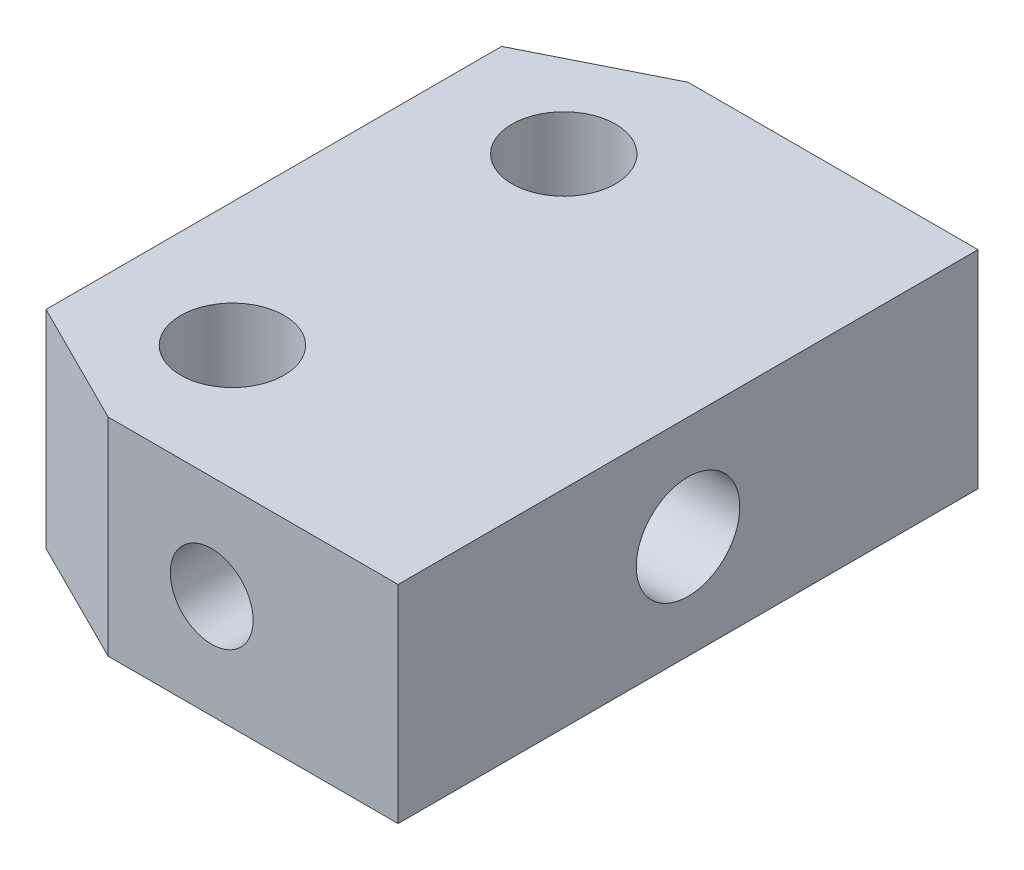
ISO-10303-21;
HEADER;
FILE_DESCRIPTION(('STEP AP214'),'2;1');
FILE_NAME('part.step','',(''),(''),'','','');
FILE_SCHEMA(('AUTOMOTIVE_DESIGN { 1 0 10303 214 1 1 1 1 }'));
ENDSEC;
DATA;
#1=APPLICATION_CONTEXT('core data for automotive mechanical design processes');
#2=APPLICATION_PROTOCOL_DEFINITION('international standard','automotive_design',2000,#1);
#3=PRODUCT_CONTEXT('',#1,'mechanical');
#4=PRODUCT('Part','Part','',(#3));
#5=PRODUCT_RELATED_PRODUCT_CATEGORY('part','',(#4));
#6=PRODUCT_DEFINITION_FORMATION('','',#4);
#7=PRODUCT_DEFINITION_CONTEXT('part definition',#1,'design');
#8=PRODUCT_DEFINITION('design','',#6,#7);
#9=PRODUCT_DEFINITION_SHAPE('','',#8);
#10=(LENGTH_UNIT() NAMED_UNIT(*) SI_UNIT(.MILLI.,.METRE.));
#11=(NAMED_UNIT(*) PLANE_ANGLE_UNIT() SI_UNIT($,.RADIAN.));
#12=(NAMED_UNIT(*) SI_UNIT($,.STERADIAN.) SOLID_ANGLE_UNIT());
#13=UNCERTAINTY_MEASURE_WITH_UNIT(LENGTH_MEASURE(1.E-05),#10,'distance_accuracy_value','');
#14=(GEOMETRIC_REPRESENTATION_CONTEXT(3) GLOBAL_UNCERTAINTY_ASSIGNED_CONTEXT((#13)) GLOBAL_UNIT_ASSIGNED_CONTEXT((#10,
#11,#12)) REPRESENTATION_CONTEXT('',''));
#15=CARTESIAN_POINT('',(0.,0.,0.));
#16=DIRECTION('',(0.,0.,1.));
#17=DIRECTION('',(1.,0.,0.));
#18=AXIS2_PLACEMENT_3D('',#15,#16,#17);
#19=CARTESIAN_POINT('',(49.9999999113847,-75.0000011423657,-47.5000000259094));
#20=DIRECTION('',(-1.,0.,0.));
#21=DIRECTION('',(0.,0.,1.));
#22=AXIS2_PLACEMENT_3D('',#19,#20,#21);
#23=PLANE('',#22);
#24=CARTESIAN_POINT('',(49.9999999113847,-70.0000001948221,-33.5000000259094));
#25=DIRECTION('',(-1.,0.,0.));
#26=DIRECTION('',(0.,0.,1.));
#27=AXIS2_PLACEMENT_3D('',#24,#25,#26);
#28=CIRCLE('',#27,2.49999999999999);
#29=CARTESIAN_POINT('',(49.9999999113847,-70.0000001948221,-31.0000000259094));
#30=VERTEX_POINT('',#29);
#31=EDGE_CURVE('E198',#30,#30,#28,.T.);
#32=ORIENTED_EDGE('',*,*,#31,.F.);
#33=EDGE_LOOP('',(#32));
#34=FACE_BOUND('',#33,.T.);
#35=DIRECTION('',(0.,0.,1.));
#36=VECTOR('',#35,1.);
#37=CARTESIAN_POINT('',(49.9999999113847,-75.0000011423657,-47.5000000259094));
#38=LINE('',#37,#36);
#39=CARTESIAN_POINT('',(49.9999999113847,-75.0000011423657,-44.499999955065));
#40=VERTEX_POINT('',#39);
#41=CARTESIAN_POINT('',(49.9999999113847,-75.0000011423657,-22.5000000967538));
#42=VERTEX_POINT('',#41);
#43=EDGE_CURVE('E94',#40,#42,#38,.T.);
#44=ORIENTED_EDGE('',*,*,#43,.T.);
#45=DIRECTION('',(0.,1.,0.));
#46=VECTOR('',#45,1.);
#47=CARTESIAN_POINT('',(49.9999999113847,-75.0000011423657,-22.5000000967538));
#48=LINE('',#47,#46);
#49=CARTESIAN_POINT('',(49.9999999113847,-65.0000010803768,-22.5000000967538));
#50=VERTEX_POINT('',#49);
#51=EDGE_CURVE('E209',#42,#50,#48,.T.);
#52=ORIENTED_EDGE('',*,*,#51,.T.);
#53=DIRECTION('',(0.,0.,1.));
#54=VECTOR('',#53,1.);
#55=CARTESIAN_POINT('',(49.9999999113847,-65.0000010803768,-47.5000000259094));
#56=LINE('',#55,#54);
#57=CARTESIAN_POINT('',(49.9999999113847,-65.0000010803768,-44.499999955065));
#58=VERTEX_POINT('',#57);
#59=EDGE_CURVE('E109',#58,#50,#56,.T.);
#60=ORIENTED_EDGE('',*,*,#59,.F.);
#61=DIRECTION('',(0.,-1.,0.));
#62=VECTOR('',#61,1.);
#63=CARTESIAN_POINT('',(49.9999999113847,-75.0000011423657,-44.499999955065));
#64=LINE('',#63,#62);
#65=EDGE_CURVE('E119',#58,#40,#64,.T.);
#66=ORIENTED_EDGE('',*,*,#65,.T.);
#67=EDGE_LOOP('',(#44,#52,#60,#66));
#68=FACE_BOUND('',#67,.T.);
#69=ADVANCED_FACE('F32',(#34,#68),#23,.T.);
#70=CARTESIAN_POINT('',(69.9999999556625,-75.0000011423657,-47.5000000259094));
#71=DIRECTION('',(0.,0.,-1.));
#72=DIRECTION('',(-1.,0.,0.));
#73=AXIS2_PLACEMENT_3D('',#70,#71,#72);
#74=PLANE('',#73);
#75=CARTESIAN_POINT('',(60.9999999999402,-70.,-47.5000000259094));
#76=DIRECTION('',(0.,0.,-1.));
#77=DIRECTION('',(-1.,0.,0.));
#78=AXIS2_PLACEMENT_3D('',#75,#76,#77);
#79=CIRCLE('',#78,1.99999999999999);
#80=CARTESIAN_POINT('',(58.9999999999402,-70.,-47.5000000259094));
#81=VERTEX_POINT('',#80);
#82=EDGE_CURVE('E129',#81,#81,#79,.T.);
#83=ORIENTED_EDGE('',*,*,#82,.F.);
#84=EDGE_LOOP('',(#83));
#85=FACE_BOUND('',#84,.T.);
#86=DIRECTION('',(-1.,0.,0.));
#87=VECTOR('',#86,1.);
#88=CARTESIAN_POINT('',(69.9999999556625,-75.0000011423657,-47.5000000259094));
#89=LINE('',#88,#87);
#90=CARTESIAN_POINT('',(69.9999999556625,-75.0000011423657,-47.5000000259094));
#91=VERTEX_POINT('',#90);
#92=CARTESIAN_POINT('',(56.0000000530734,-75.0000011423657,-47.5000000259094));
#93=VERTEX_POINT('',#92);
#94=EDGE_CURVE('E102',#91,#93,#89,.T.);
#95=ORIENTED_EDGE('',*,*,#94,.T.);
#96=DIRECTION('',(0.,1.,0.));
#97=VECTOR('',#96,1.);
#98=CARTESIAN_POINT('',(56.0000000530734,-75.0000011423657,-47.5000000259094));
#99=LINE('',#98,#97);
#100=CARTESIAN_POINT('',(56.0000000530734,-65.0000010803768,-47.5000000259094));
#101=VERTEX_POINT('',#100);
#102=EDGE_CURVE('E11',#93,#101,#99,.T.);
#103=ORIENTED_EDGE('',*,*,#102,.T.);
#104=DIRECTION('',(-1.,0.,0.));
#105=VECTOR('',#104,1.);
#106=CARTESIAN_POINT('',(69.9999999556625,-65.0000010803768,-47.5000000259094));
#107=LINE('',#106,#105);
#108=CARTESIAN_POINT('',(69.9999999556625,-65.0000010803768,-47.5000000259094));
#109=VERTEX_POINT('',#108);
#110=EDGE_CURVE('E116',#109,#101,#107,.T.);
#111=ORIENTED_EDGE('',*,*,#110,.F.);
#112=DIRECTION('',(0.,1.,0.));
#113=VECTOR('',#112,1.);
#114=CARTESIAN_POINT('',(69.9999999556625,-75.0000011423657,-47.5000000259094));
#115=LINE('',#114,#113);
#116=EDGE_CURVE('E101',#91,#109,#115,.T.);
#117=ORIENTED_EDGE('',*,*,#116,.F.);
#118=EDGE_LOOP('',(#95,#103,#111,#117));
#119=FACE_BOUND('',#118,.T.);
#120=ADVANCED_FACE('F152',(#85,#119),#74,.T.);
#121=CARTESIAN_POINT('',(69.9999999556625,-75.0000011423657,-19.5000000259094));
#122=DIRECTION('',(1.,0.,0.));
#123=DIRECTION('',(0.,0.,-1.));
#124=AXIS2_PLACEMENT_3D('',#121,#122,#123);
#125=PLANE('',#124);
#126=CARTESIAN_POINT('',(69.9999999556625,-70.0000001948221,-33.5000000259094));
#127=DIRECTION('',(-1.,0.,0.));
#128=DIRECTION('',(0.,0.,1.));
#129=AXIS2_PLACEMENT_3D('',#126,#127,#128);
#130=CIRCLE('',#129,2.49999999999999);
#131=CARTESIAN_POINT('',(69.9999999556625,-70.0000001948221,-31.0000000259094));
#132=VERTEX_POINT('',#131);
#133=EDGE_CURVE('E193',#132,#132,#130,.T.);
#134=ORIENTED_EDGE('',*,*,#133,.T.);
#135=EDGE_LOOP('',(#134));
#136=FACE_BOUND('',#135,.T.);
#137=DIRECTION('',(0.,0.,-1.));
#138=VECTOR('',#137,1.);
#139=CARTESIAN_POINT('',(69.9999999556625,-65.0000010803768,-19.5000000259094));
#140=LINE('',#139,#138);
#141=CARTESIAN_POINT('',(69.9999999556625,-65.0000010803768,-19.5000000259094));
#142=VERTEX_POINT('',#141);
#143=EDGE_CURVE('E100',#142,#109,#140,.T.);
#144=ORIENTED_EDGE('',*,*,#143,.F.);
#145=DIRECTION('',(0.,1.,0.));
#146=VECTOR('',#145,1.);
#147=CARTESIAN_POINT('',(69.9999999556625,-75.0000011423657,-19.5000000259094));
#148=LINE('',#147,#146);
#149=CARTESIAN_POINT('',(69.9999999556625,-75.0000011423657,-19.5000000259094));
#150=VERTEX_POINT('',#149);
#151=EDGE_CURVE('E89',#150,#142,#148,.T.);
#152=ORIENTED_EDGE('',*,*,#151,.F.);
#153=DIRECTION('',(0.,0.,-1.));
#154=VECTOR('',#153,1.);
#155=CARTESIAN_POINT('',(69.9999999556625,-75.0000011423657,-19.5000000259094));
#156=LINE('',#155,#154);
#157=EDGE_CURVE('E93',#150,#91,#156,.T.);
#158=ORIENTED_EDGE('',*,*,#157,.T.);
#159=ORIENTED_EDGE('',*,*,#116,.T.);
#160=EDGE_LOOP('',(#144,#152,#158,#159));
#161=FACE_BOUND('',#160,.T.);
#162=ADVANCED_FACE('F98',(#136,#161),#125,.T.);
#163=CARTESIAN_POINT('',(49.9999999113847,-75.0000011423657,-19.5000000259094));
#164=DIRECTION('',(0.,0.,1.));
#165=DIRECTION('',(1.,0.,0.));
#166=AXIS2_PLACEMENT_3D('',#163,#164,#165);
#167=PLANE('',#166);
#168=CARTESIAN_POINT('',(60.9999999999402,-70.,-19.5000000259094));
#169=DIRECTION('',(0.,0.,1.));
#170=DIRECTION('',(1.,0.,0.));
#171=AXIS2_PLACEMENT_3D('',#168,#169,#170);
#172=CIRCLE('',#171,1.99999999999999);
#173=CARTESIAN_POINT('',(62.9999999999402,-70.,-19.5000000259094));
#174=VERTEX_POINT('',#173);
#175=EDGE_CURVE('E303',#174,#174,#172,.T.);
#176=ORIENTED_EDGE('',*,*,#175,.F.);
#177=EDGE_LOOP('',(#176));
#178=FACE_BOUND('',#177,.T.);
#179=DIRECTION('',(1.,0.,0.));
#180=VECTOR('',#179,1.);
#181=CARTESIAN_POINT('',(49.9999999113847,-65.0000010803768,-19.5000000259094));
#182=LINE('',#181,#180);
#183=CARTESIAN_POINT('',(56.0000000530734,-65.0000010803768,-19.5000000259094));
#184=VERTEX_POINT('',#183);
#185=EDGE_CURVE('E112',#184,#142,#182,.T.);
#186=ORIENTED_EDGE('',*,*,#185,.F.);
#187=DIRECTION('',(0.,-1.,0.));
#188=VECTOR('',#187,1.);
#189=CARTESIAN_POINT('',(56.0000000530734,-75.0000011423657,-19.5000000259094));
#190=LINE('',#189,#188);
#191=CARTESIAN_POINT('',(56.0000000530734,-75.0000011423657,-19.5000000259094));
#192=VERTEX_POINT('',#191);
#193=EDGE_CURVE('E55',#184,#192,#190,.T.);
#194=ORIENTED_EDGE('',*,*,#193,.T.);
#195=DIRECTION('',(1.,0.,0.));
#196=VECTOR('',#195,1.);
#197=CARTESIAN_POINT('',(49.9999999113847,-75.0000011423657,-19.5000000259094));
#198=LINE('',#197,#196);
#199=EDGE_CURVE('E86',#192,#150,#198,.T.);
#200=ORIENTED_EDGE('',*,*,#199,.T.);
#201=ORIENTED_EDGE('',*,*,#151,.T.);
#202=EDGE_LOOP('',(#186,#194,#200,#201));
#203=FACE_BOUND('',#202,.T.);
#204=ADVANCED_FACE('F88',(#178,#203),#167,.T.);
#205=CARTESIAN_POINT('',(0.,-75.0000011423657,0.));
#206=DIRECTION('',(0.,1.,0.));
#207=DIRECTION('',(0.,0.,1.));
#208=AXIS2_PLACEMENT_3D('',#205,#206,#207);
#209=PLANE('',#208);
#210=CARTESIAN_POINT('',(55.9999988763926,-75.0000011423657,-25.5000001089302));
#211=DIRECTION('',(0.,-1.,0.));
#212=DIRECTION('',(0.,0.,-1.));
#213=AXIS2_PLACEMENT_3D('',#210,#211,#212);
#214=CIRCLE('',#213,2.49999999999999);
#215=CARTESIAN_POINT('',(55.9999988763926,-75.0000011423657,-28.0000001089301));
#216=VERTEX_POINT('',#215);
#217=EDGE_CURVE('E192',#216,#216,#214,.T.);
#218=ORIENTED_EDGE('',*,*,#217,.F.);
#219=EDGE_LOOP('',(#218));
#220=FACE_BOUND('',#219,.T.);
#221=CARTESIAN_POINT('',(55.9999988763926,-75.0000011423657,-41.5000001089302));
#222=DIRECTION('',(0.,-1.,0.));
#223=DIRECTION('',(0.,0.,-1.));
#224=AXIS2_PLACEMENT_3D('',#221,#222,#223);
#225=CIRCLE('',#224,2.49999999999999);
#226=CARTESIAN_POINT('',(55.9999988763926,-75.0000011423657,-44.0000001089301));
#227=VERTEX_POINT('',#226);
#228=EDGE_CURVE('E195',#227,#227,#225,.T.);
#229=ORIENTED_EDGE('',*,*,#228,.F.);
#230=EDGE_LOOP('',(#229));
#231=FACE_BOUND('',#230,.T.);
#232=ORIENTED_EDGE('',*,*,#199,.F.);
#233=DIRECTION('',(0.894427190999914,0.,0.447213595499963));
#234=VECTOR('',#233,1.);
#235=CARTESIAN_POINT('',(49.9999999113847,-75.0000011423657,-22.5000000967538));
#236=LINE('',#235,#234);
#237=EDGE_CURVE('E40',#192,#42,#236,.F.);
#238=ORIENTED_EDGE('',*,*,#237,.T.);
#239=ORIENTED_EDGE('',*,*,#43,.F.);
#240=DIRECTION('',(-0.894427190999914,0.,0.447213595499963));
#241=VECTOR('',#240,1.);
#242=CARTESIAN_POINT('',(56.0000000530734,-75.0000011423657,-47.5000000259094));
#243=LINE('',#242,#241);
#244=EDGE_CURVE('E47',#40,#93,#243,.F.);
#245=ORIENTED_EDGE('',*,*,#244,.T.);
#246=ORIENTED_EDGE('',*,*,#94,.F.);
#247=ORIENTED_EDGE('',*,*,#157,.F.);
#248=EDGE_LOOP('',(#232,#238,#239,#245,#246,#247));
#249=FACE_BOUND('',#248,.T.);
#250=ADVANCED_FACE('F104',(#220,#231,#249),#209,.F.);
#251=CARTESIAN_POINT('',(0.,-65.0000010803768,0.));
#252=DIRECTION('',(0.,1.,0.));
#253=DIRECTION('',(0.,0.,1.));
#254=AXIS2_PLACEMENT_3D('',#251,#252,#253);
#255=PLANE('',#254);
#256=CARTESIAN_POINT('',(55.9999988763926,-65.0000010803768,-25.5000001089302));
#257=DIRECTION('',(0.,-1.,0.));
#258=DIRECTION('',(0.,0.,-1.));
#259=AXIS2_PLACEMENT_3D('',#256,#257,#258);
#260=CIRCLE('',#259,2.5);
#261=CARTESIAN_POINT('',(55.9999988763926,-65.0000010803768,-28.0000001089302));
#262=VERTEX_POINT('',#261);
#263=EDGE_CURVE('E189',#262,#262,#260,.T.);
#264=ORIENTED_EDGE('',*,*,#263,.T.);
#265=EDGE_LOOP('',(#264));
#266=FACE_BOUND('',#265,.T.);
#267=CARTESIAN_POINT('',(55.9999988763926,-65.0000010803768,-41.5000001089302));
#268=DIRECTION('',(0.,-1.,0.));
#269=DIRECTION('',(0.,0.,-1.));
#270=AXIS2_PLACEMENT_3D('',#267,#268,#269);
#271=CIRCLE('',#270,2.5);
#272=CARTESIAN_POINT('',(55.9999988763926,-65.0000010803768,-44.0000001089302));
#273=VERTEX_POINT('',#272);
#274=EDGE_CURVE('E113',#273,#273,#271,.T.);
#275=ORIENTED_EDGE('',*,*,#274,.T.);
#276=EDGE_LOOP('',(#275));
#277=FACE_BOUND('',#276,.T.);
#278=ORIENTED_EDGE('',*,*,#59,.T.);
#279=DIRECTION('',(-0.894427190999914,0.,-0.447213595499963));
#280=VECTOR('',#279,1.);
#281=CARTESIAN_POINT('',(19.0000000209787,-65.0000010803768,-38.000000041957));
#282=LINE('',#281,#280);
#283=EDGE_CURVE('E211',#50,#184,#282,.F.);
#284=ORIENTED_EDGE('',*,*,#283,.T.);
#285=ORIENTED_EDGE('',*,*,#185,.T.);
#286=ORIENTED_EDGE('',*,*,#143,.T.);
#287=ORIENTED_EDGE('',*,*,#110,.T.);
#288=DIRECTION('',(0.894427190999914,0.,-0.447213595499963));
#289=VECTOR('',#288,1.);
#290=CARTESIAN_POINT('',(-7.799999999749,-65.0000010803768,-15.5999999994978));
#291=LINE('',#290,#289);
#292=EDGE_CURVE('E212',#101,#58,#291,.F.);
#293=ORIENTED_EDGE('',*,*,#292,.T.);
#294=EDGE_LOOP('',(#278,#284,#285,#286,#287,#293));
#295=FACE_BOUND('',#294,.T.);
#296=ADVANCED_FACE('F169',(#266,#277,#295),#255,.T.);
#297=CARTESIAN_POINT('',(55.9999988763926,-75.0000011423657,-41.5000001089302));
#298=DIRECTION('',(0.,-1.,0.));
#299=DIRECTION('',(0.,0.,-1.));
#300=AXIS2_PLACEMENT_3D('',#297,#298,#299);
#301=CYLINDRICAL_SURFACE('',#300,2.5);
#302=ORIENTED_EDGE('',*,*,#274,.F.);
#303=EDGE_LOOP('',(#302));
#304=FACE_BOUND('',#303,.T.);
#305=ORIENTED_EDGE('',*,*,#228,.T.);
#306=EDGE_LOOP('',(#305));
#307=FACE_BOUND('',#306,.T.);
#308=ADVANCED_FACE('F172',(#304,#307),#301,.F.);
#309=CARTESIAN_POINT('',(55.9999988763926,-75.0000011423657,-25.5000001089302));
#310=DIRECTION('',(0.,-1.,0.));
#311=DIRECTION('',(0.,0.,-1.));
#312=AXIS2_PLACEMENT_3D('',#309,#310,#311);
#313=CYLINDRICAL_SURFACE('',#312,2.5);
#314=ORIENTED_EDGE('',*,*,#263,.F.);
#315=EDGE_LOOP('',(#314));
#316=FACE_BOUND('',#315,.T.);
#317=ORIENTED_EDGE('',*,*,#217,.T.);
#318=EDGE_LOOP('',(#317));
#319=FACE_BOUND('',#318,.T.);
#320=ADVANCED_FACE('F178',(#316,#319),#313,.F.);
#321=CARTESIAN_POINT('',(49.9999999113847,-70.0000001948221,-33.5000000259094));
#322=DIRECTION('',(-1.,0.,0.));
#323=DIRECTION('',(0.,0.,1.));
#324=AXIS2_PLACEMENT_3D('',#321,#322,#323);
#325=CYLINDRICAL_SURFACE('',#324,2.49999999999999);
#326=CARTESIAN_POINT('',(62.9999999999402,-70.0000001948221,-31.0000000259094));
#327=CARTESIAN_POINT('',(62.9999924298464,-69.9040032999878,-31.0000073764472));
#328=CARTESIAN_POINT('',(62.9930305902491,-69.8078670046997,-31.0055863415854));
#329=CARTESIAN_POINT('',(62.9656500983877,-69.618680833531,-31.0274073316969));
#330=CARTESIAN_POINT('',(62.9452016771167,-69.5256382647739,-31.0436729450626));
#331=CARTESIAN_POINT('',(62.8923217893113,-69.3459052809561,-31.0853328069254));
#332=CARTESIAN_POINT('',(62.8599667266228,-69.2591784982736,-31.1106688239031));
#333=CARTESIAN_POINT('',(62.7848827541548,-69.0930738687919,-31.1686399167726));
#334=CARTESIAN_POINT('',(62.7421538114965,-69.0136960452855,-31.201275015798));
#335=CARTESIAN_POINT('',(62.631371764443,-68.8368189453389,-31.284243385104));
#336=CARTESIAN_POINT('',(62.5596812265407,-68.7426324966901,-31.3367825503096));
#337=CARTESIAN_POINT('',(62.4027221009527,-68.56958648556,-31.447078121063));
#338=CARTESIAN_POINT('',(62.3174144259456,-68.4907725418039,-31.5048493318926));
#339=CARTESIAN_POINT('',(62.1332262216892,-68.3478409520092,-31.6214400558433));
#340=CARTESIAN_POINT('',(62.0341534462962,-68.2839737481793,-31.6802617746281));
#341=CARTESIAN_POINT('',(61.8234614646792,-68.1735317677756,-31.7911790148941));
#342=CARTESIAN_POINT('',(61.7118859276445,-68.1268991060936,-31.8432966613539));
#343=CARTESIAN_POINT('',(61.5261213316155,-68.069139639708,-31.9116436452966));
#344=CARTESIAN_POINT('',(61.4561885535467,-68.0513453102486,-31.9337129051489));
#345=CARTESIAN_POINT('',(61.3127876215748,-68.0232660805797,-31.9693013229597));
#346=CARTESIAN_POINT('',(61.2393286381099,-68.0129627188286,-31.982841489837));
#347=CARTESIAN_POINT('',(61.0898077996305,-68.0006016129646,-31.9991579255146));
#348=CARTESIAN_POINT('',(61.0137288345445,-67.9986165460268,-32.0018393140767));
#349=CARTESIAN_POINT('',(60.8622954256273,-68.003305161085,-31.9956006905895));
#350=CARTESIAN_POINT('',(60.7869416493192,-68.0099861710929,-31.9866708601085));
#351=CARTESIAN_POINT('',(60.6277780354359,-68.0330469101425,-31.9567931415181));
#352=CARTESIAN_POINT('',(60.5444923558227,-68.0507818345204,-31.9341819524278));
#353=CARTESIAN_POINT('',(60.3834648457523,-68.0955543964853,-31.8800258090597));
#354=CARTESIAN_POINT('',(60.305740268325,-68.122619587624,-31.8484544435208));
#355=CARTESIAN_POINT('',(60.1193383409859,-68.2002587604106,-31.7634392930858));
#356=CARTESIAN_POINT('',(60.0141977516322,-68.2558508811418,-31.706866733208));
#357=CARTESIAN_POINT('',(59.8162837733276,-68.3836149961354,-31.5908626700909));
#358=CARTESIAN_POINT('',(59.723528728576,-68.4558111613703,-31.5314270997905));
#359=CARTESIAN_POINT('',(59.548725659509,-68.6185413654356,-31.4138729353151));
#360=CARTESIAN_POINT('',(59.4670284926992,-68.7095124986665,-31.3558315475144));
#361=CARTESIAN_POINT('',(59.3199008737807,-68.90801451716,-31.2482816841435));
#362=CARTESIAN_POINT('',(59.2544268312896,-69.0154997414527,-31.198750454772));
#363=CARTESIAN_POINT('',(59.1594374338367,-69.2122215272967,-31.1257544523512));
#364=CARTESIAN_POINT('',(59.1249957424403,-69.2978216117345,-31.0988895635684));
#365=CARTESIAN_POINT('',(59.0678737272874,-69.4750854177588,-31.0540245675678));
#366=CARTESIAN_POINT('',(59.0451845390959,-69.5667445102653,-31.036017779562));
#367=CARTESIAN_POINT('',(59.0128615306124,-69.7542861324188,-31.0102967502693));
#368=CARTESIAN_POINT('',(59.0032959206808,-69.8501880738164,-31.0026362876305));
#369=CARTESIAN_POINT('',(58.9981409376621,-70.042607421427,-30.998513184933));
#370=CARTESIAN_POINT('',(59.0025489611272,-70.1391247096499,-31.0020484589803));
#371=CARTESIAN_POINT('',(59.0240827304114,-70.3217461488229,-31.0192313458789));
#372=CARTESIAN_POINT('',(59.0401490675782,-70.4080603769927,-31.0320363842575));
#373=CARTESIAN_POINT('',(59.0828720334783,-70.5763351844382,-31.0658247314077));
#374=CARTESIAN_POINT('',(59.1095318051304,-70.6582944634747,-31.0868104672386));
#375=CARTESIAN_POINT('',(59.174150165615,-70.8212354184359,-31.1371013045593));
#376=CARTESIAN_POINT('',(59.2127055562008,-70.9018431635301,-31.1668406471764));
#377=CARTESIAN_POINT('',(59.2988618754696,-71.0554095588813,-31.2321635008064));
#378=CARTESIAN_POINT('',(59.3464632552588,-71.1283678273918,-31.2677473032595));
#379=CARTESIAN_POINT('',(59.4592239646947,-71.279251948518,-31.3500627810704));
#380=CARTESIAN_POINT('',(59.5260013042276,-71.3555067685058,-31.3976299313012));
#381=CARTESIAN_POINT('',(59.6693865075578,-71.4965364712707,-31.4955645991034));
#382=CARTESIAN_POINT('',(59.7460223480482,-71.56127738334,-31.5459398456586));
#383=CARTESIAN_POINT('',(59.876433896986,-71.6556845082398,-31.6262581727041));
#384=CARTESIAN_POINT('',(59.9273600231345,-71.6891370570338,-31.6564520798103));
#385=CARTESIAN_POINT('',(60.0326216495012,-71.7515496808073,-31.7156453472012));
#386=CARTESIAN_POINT('',(60.0869589370187,-71.7805073726167,-31.7446440678552));
#387=CARTESIAN_POINT('',(60.1988741586357,-71.8335806013066,-31.8001612058748));
#388=CARTESIAN_POINT('',(60.2564390618144,-71.8577140339569,-31.8266885874655));
#389=CARTESIAN_POINT('',(60.3750082239776,-71.9008845709617,-31.8758974078997));
#390=CARTESIAN_POINT('',(60.4360099576906,-71.9199253595968,-31.8985816227088));
#391=CARTESIAN_POINT('',(60.5660859307688,-71.9536014833736,-31.9398053592021));
#392=CARTESIAN_POINT('',(60.6354218853568,-71.9677954536106,-31.9579024263645));
#393=CARTESIAN_POINT('',(60.7768368674573,-71.9887889733362,-31.9850659449237));
#394=CARTESIAN_POINT('',(60.8489084955644,-71.9956071768158,-31.9941551730604));
#395=CARTESIAN_POINT('',(60.9943480317186,-72.0013205862535,-32.0017523964971));
#396=CARTESIAN_POINT('',(61.0677208112235,-72.0001732207371,-32.0002035376922));
#397=CARTESIAN_POINT('',(61.2129836170498,-71.9899652582439,-31.986692135535));
#398=CARTESIAN_POINT('',(61.2848711075114,-71.9808921153747,-31.9747130820891));
#399=CARTESIAN_POINT('',(61.4446062458974,-71.9520775764892,-31.9379291643498));
#400=CARTESIAN_POINT('',(61.5314225338126,-71.9300924539585,-31.9105073884542));
#401=CARTESIAN_POINT('',(61.6986328962854,-71.8760819877999,-31.8471109744017));
#402=CARTESIAN_POINT('',(61.7790071641623,-71.844027065912,-31.8111112161482));
#403=CARTESIAN_POINT('',(61.9121771145798,-71.780947773871,-31.7450885570162));
#404=CARTESIAN_POINT('',(61.9665185743794,-71.7520239664031,-31.7161110905652));
#405=CARTESIAN_POINT('',(62.0718376247842,-71.6896477211731,-31.6569207120493));
#406=CARTESIAN_POINT('',(62.1228139816958,-71.6561936361132,-31.6267073533918));
#407=CARTESIAN_POINT('',(62.2707788079938,-71.5491848419346,-31.5356202809149));
#408=CARTESIAN_POINT('',(62.3627980999043,-71.4689859578711,-31.4743021955179));
#409=CARTESIAN_POINT('',(62.5333889131681,-71.2900178420232,-31.3558175164138));
#410=CARTESIAN_POINT('',(62.6117696980463,-71.1910203703979,-31.2987153869756));
#411=CARTESIAN_POINT('',(62.715576252355,-71.0299847925747,-31.2212537891316));
#412=CARTESIAN_POINT('',(62.747867985274,-70.9742562222458,-31.1968116107727));
#413=CARTESIAN_POINT('',(62.8073676827456,-70.858855707401,-31.1513391219792));
#414=CARTESIAN_POINT('',(62.8345787587061,-70.7991862068347,-31.1303067244322));
#415=CARTESIAN_POINT('',(62.8917797322003,-70.655038686275,-31.0857911750007));
#416=CARTESIAN_POINT('',(62.9194823886036,-70.5691111955153,-31.0639712748266));
#417=CARTESIAN_POINT('',(62.9631574804618,-70.392714063008,-31.029411498632));
#418=CARTESIAN_POINT('',(62.9791606415835,-70.3022569902713,-31.0166478413757));
#419=CARTESIAN_POINT('',(62.9925629539327,-70.1758817673382,-31.0059462862747));
#420=CARTESIAN_POINT('',(62.9953473308998,-70.1408092621493,-31.003720865489));
#421=CARTESIAN_POINT('',(62.9990674497576,-70.070497528054,-31.0007462212072));
#422=CARTESIAN_POINT('',(63.0000027803102,-70.0352582637979,-30.9999973261787));
#423=CARTESIAN_POINT('',(62.9999999999402,-70.0000001948221,-31.0000000259094));
#424=B_SPLINE_CURVE_WITH_KNOTS('',3,(#326,#327,#328,#329,#330,#331,#332,#333,#334,#335,#336,
#337,#338,#339,#340,#341,#342,#343,#344,#345,#346,#347,#348,#349,#350,#351,#352,#353,#354,#355,
#356,#357,#358,#359,#360,#361,#362,#363,#364,#365,#366,#367,#368,#369,#370,#371,#372,#373,#374,
#375,#376,#377,#378,#379,#380,#381,#382,#383,#384,#385,#386,#387,#388,#389,#390,#391,#392,#393,
#394,#395,#396,#397,#398,#399,#400,#401,#402,#403,#404,#405,#406,#407,#408,#409,#410,#411,#412,
#413,#414,#415,#416,#417,#418,#419,#420,#421,#422,#423),.UNSPECIFIED.,.T.,.F.,(4,2,2,2,2,2,2,2,
2,2,2,2,2,2,2,2,2,2,2,2,2,2,2,2,2,2,2,2,2,2,2,2,2,2,2,2,2,2,2,2,2,2,2,2,2,2,2,2,4),(0.,
0.287836600642867,0.576310680528725,0.862965039145646,1.14962030629125,1.53607885517205,
1.92366735133596,2.31734738529822,2.70969289653127,2.93534482729841,3.16043873456958,
3.38749524532496,3.61474387968872,3.87758616601292,4.14121140682415,4.53425719162878,
4.92787880696819,5.33198135014255,5.73498602806559,6.02213942647361,6.30907592020977,
6.59749819982964,6.88586674623768,7.15086988120218,7.41595169753676,7.69742732675075,
7.97891699630418,8.31365504437298,8.64936488807977,8.85316515073685,9.05707310175746,
9.26021000800235,9.46319955459461,9.68152083125503,9.89928865310226,10.1182212137024,
10.3375009568767,10.6169326938051,10.8971930101441,11.1010634738148,11.3050082688455,
11.7129158420324,12.1261355909743,12.3324803019429,12.5386982293867,12.8161532668796,
13.092876997651,13.1985711021029,13.3042887165813),.UNSPECIFIED.);
#425=CARTESIAN_POINT('',(62.9999999999402,-70.0000001948221,-31.0000000259094));
#426=VERTEX_POINT('',#425);
#427=EDGE_CURVE('E128',#426,#426,#424,.T.);
#428=ORIENTED_EDGE('',*,*,#427,.T.);
#429=EDGE_LOOP('',(#428));
#430=FACE_BOUND('',#429,.T.);
#431=CARTESIAN_POINT('',(58.9999999999402,-70.,-36.0000000259094));
#432=CARTESIAN_POINT('',(59.0000075793756,-69.9040031012198,-35.9999926679));
#433=CARTESIAN_POINT('',(59.0069694289416,-69.8078668028334,-35.9944136947841));
#434=CARTESIAN_POINT('',(59.0343499412535,-69.6186806276145,-35.9725926884918));
#435=CARTESIAN_POINT('',(59.0547983730668,-69.5256380579258,-35.9563270668753));
#436=CARTESIAN_POINT('',(59.1076782817514,-69.3459050746706,-35.9146671890642));
#437=CARTESIAN_POINT('',(59.1400333547366,-69.2591782934495,-35.8893311644171));
#438=CARTESIAN_POINT('',(59.215117347333,-69.0930736686254,-35.8313600571836));
#439=CARTESIAN_POINT('',(59.2578462998073,-69.0136958483041,-35.7987249514745));
#440=CARTESIAN_POINT('',(59.3686283714705,-68.8368187538812,-35.7157565663341));
#441=CARTESIAN_POINT('',(59.4403189245162,-68.7426323085114,-35.6632173921484));
#442=CARTESIAN_POINT('',(59.597278081176,-68.5695863062465,-35.552921805841));
#443=CARTESIAN_POINT('',(59.6825857721439,-68.49077236812,-35.4951505884332));
#444=CARTESIAN_POINT('',(59.8667740099446,-68.3478407923948,-35.3785598554592));
#445=CARTESIAN_POINT('',(59.9658468029391,-68.2839735970419,-35.3197381342954));
#446=CARTESIAN_POINT('',(60.1765388220182,-68.1735316377547,-35.2088208975514));
#447=CARTESIAN_POINT('',(60.2881143788361,-68.126898988609,-35.1567032569311));
#448=CARTESIAN_POINT('',(60.4738789925619,-68.0691395515764,-35.0883562990078));
#449=CARTESIAN_POINT('',(60.543811767399,-68.0513452353447,-35.0662870531928));
#450=CARTESIAN_POINT('',(60.687212690269,-68.0232660314745,-35.0306986651564));
#451=CARTESIAN_POINT('',(60.7606716678695,-68.0129626822942,-35.0171585140102));
#452=CARTESIAN_POINT('',(60.9101924899526,-68.0006016003072,-35.0008421092989));
#453=CARTESIAN_POINT('',(60.9862714444512,-67.9986165445655,-34.9981607358384));
#454=CARTESIAN_POINT('',(61.1377048293267,-68.0033051791109,-35.0043993851897));
#455=CARTESIAN_POINT('',(61.2130585921756,-68.0099861974332,-35.0133292264641));
#456=CARTESIAN_POINT('',(61.3722222053626,-68.0330469550928,-35.0432069678456));
#457=CARTESIAN_POINT('',(61.4555078961911,-68.0507818928773,-35.0658181725004));
#458=CARTESIAN_POINT('',(61.6165354257334,-68.0955544838261,-35.1199743458917));
#459=CARTESIAN_POINT('',(61.6942600114086,-68.1226196905483,-35.1515457258858));
#460=CARTESIAN_POINT('',(61.8806619513315,-68.2002589025949,-35.2365609072107));
#461=CARTESIAN_POINT('',(61.9858025443907,-68.2558510474418,-35.2931334816706));
#462=CARTESIAN_POINT('',(62.1837165266275,-68.3836152147457,-35.4091375680494));
#463=CARTESIAN_POINT('',(62.2764715716108,-68.455811408168,-35.4685731470185));
#464=CARTESIAN_POINT('',(62.4512746316587,-68.6185416702191,-35.5861273195013));
#465=CARTESIAN_POINT('',(62.5329717896978,-68.7095128325928,-35.6441687065961));
#466=CARTESIAN_POINT('',(62.6800993837678,-68.9080149117421,-35.751718560219));
#467=CARTESIAN_POINT('',(62.7455734102372,-69.0155001675022,-35.8012497805901));
#468=CARTESIAN_POINT('',(62.8405627629623,-69.2122219881457,-35.874245752304));
#469=CARTESIAN_POINT('',(62.8750044303558,-69.2978220744983,-35.9011106233944));
#470=CARTESIAN_POINT('',(62.9321263976621,-69.4750858795118,-35.9459755831585));
#471=CARTESIAN_POINT('',(62.9548155620116,-69.5667449690953,-35.9639823526222));
#472=CARTESIAN_POINT('',(62.9871385240518,-69.7542865793565,-35.9897033453317));
#473=CARTESIAN_POINT('',(62.9967041114653,-69.8501885117347,-35.9973637899927));
#474=CARTESIAN_POINT('',(63.0018590528155,-70.0426078362674,-36.0014868593695));
#475=CARTESIAN_POINT('',(62.9974510101849,-70.1391251104336,-35.9979515699673));
#476=CARTESIAN_POINT('',(62.9759172074444,-70.3217465289043,-35.9807686565119));
#477=CARTESIAN_POINT('',(62.9598508543677,-70.4080607504458,-35.9679636056218));
#478=CARTESIAN_POINT('',(62.9171278586828,-70.5763355421701,-35.9341752355218));
#479=CARTESIAN_POINT('',(62.8904680731525,-70.6582948121114,-35.9131894892503));
#480=CARTESIAN_POINT('',(62.8258496825444,-70.8212357563621,-35.8628986299171));
#481=CARTESIAN_POINT('',(62.787294274659,-70.9018434990034,-35.8331592750107));
#482=CARTESIAN_POINT('',(62.7011379211365,-71.055409886953,-35.7678363983736));
#483=CARTESIAN_POINT('',(62.6535365243985,-71.1283681505191,-35.7322525852064));
#484=CARTESIAN_POINT('',(62.5407757750524,-71.2792522627455,-35.6499370839471));
#485=CARTESIAN_POINT('',(62.4739984120537,-71.3555070778217,-35.6023699211185));
#486=CARTESIAN_POINT('',(62.3306131600767,-71.4965367675579,-35.5044352315428));
#487=CARTESIAN_POINT('',(62.253977294358,-71.5612776714473,-35.4540599758105));
#488=CARTESIAN_POINT('',(62.1235657048847,-71.6556847785886,-35.3737416401274));
#489=CARTESIAN_POINT('',(62.0726395642965,-71.6891373192482,-35.3435477316061));
#490=CARTESIAN_POINT('',(61.9673779081314,-71.7515499253514,-35.2843544644125));
#491=CARTESIAN_POINT('',(61.9130406052529,-71.7805076076217,-35.2553557453732));
#492=CARTESIAN_POINT('',(61.8011253525415,-71.8335808151386,-35.1998386150569));
#493=CARTESIAN_POINT('',(61.7435604336685,-71.8577142362109,-35.1733112395144));
#494=CARTESIAN_POINT('',(61.6249912395347,-71.9008847476634,-35.1241024368007));
#495=CARTESIAN_POINT('',(61.5639894895516,-71.9199255223343,-35.1014182336534));
#496=CARTESIAN_POINT('',(61.4339135011409,-71.953601609307,-35.0601945343959));
#497=CARTESIAN_POINT('',(61.3645775485568,-71.9677955581936,-35.0420974916288));
#498=CARTESIAN_POINT('',(61.2231625752365,-71.9887890355947,-35.0149340247848));
#499=CARTESIAN_POINT('',(61.151090953888,-71.9956072180861,-35.0058448239765));
#500=CARTESIAN_POINT('',(61.0056514392854,-72.001320587309,-34.9982476537892));
#501=CARTESIAN_POINT('',(60.9322786746276,-72.0001732027511,-34.9997965382732));
#502=CARTESIAN_POINT('',(60.7870159028624,-71.9899652063025,-35.0133079847393));
#503=CARTESIAN_POINT('',(60.7151284316273,-71.9808920484997,-35.0252870568384));
#504=CARTESIAN_POINT('',(60.5553932850987,-71.952077471185,-35.062071019734));
#505=CARTESIAN_POINT('',(60.468576973338,-71.9300923196313,-35.0894928276109));
#506=CARTESIAN_POINT('',(60.3013665691726,-71.8760817901785,-35.1528893028395));
#507=CARTESIAN_POINT('',(60.2209922834667,-71.844026834004,-35.1888890902793));
#508=CARTESIAN_POINT('',(60.0878223193434,-71.7809474842414,-35.2549117892547));
#509=CARTESIAN_POINT('',(60.0334808617513,-71.7520236557062,-35.2838892669388));
#510=CARTESIAN_POINT('',(59.9281618168061,-71.6896473673332,-35.3430796646707));
#511=CARTESIAN_POINT('',(59.8771854631453,-71.6561932601992,-35.3732930313093));
#512=CARTESIAN_POINT('',(59.7292206487466,-71.5491843979784,-35.4643801230741));
#513=CARTESIAN_POINT('',(59.6372013673981,-71.4689854660169,-35.5256982152454));
#514=CARTESIAN_POINT('',(59.4666105915291,-71.2900172550092,-35.6441828902911));
#515=CARTESIAN_POINT('',(59.3882298324349,-71.1910197374477,-35.7012850091227));
#516=CARTESIAN_POINT('',(59.2844233257813,-71.0299840907766,-35.7787465803393));
#517=CARTESIAN_POINT('',(59.2521316102429,-70.9742554975543,-35.803188748036));
#518=CARTESIAN_POINT('',(59.1926319509564,-70.8588549376613,-35.8486612117462));
#519=CARTESIAN_POINT('',(59.1654208957947,-70.7991854149425,-35.8696935948768));
#520=CARTESIAN_POINT('',(59.1082199826302,-70.6550378624884,-35.9142091004037));
#521=CARTESIAN_POINT('',(59.0805173650502,-70.5691103641055,-35.9360289711445));
#522=CARTESIAN_POINT('',(59.0368423519386,-70.3927132243897,-35.9705886864032));
#523=CARTESIAN_POINT('',(59.0208392307101,-70.3022561520581,-35.9833523121831));
#524=CARTESIAN_POINT('',(59.0074369834849,-70.1758810383875,-35.9940538154596));
#525=CARTESIAN_POINT('',(59.0046526268884,-70.1408086388966,-35.9962792199795));
#526=CARTESIAN_POINT('',(59.0009325375526,-70.0704971179996,-35.9992538406698));
#527=CARTESIAN_POINT('',(58.9999972161478,-70.0352579612442,-36.000002728376));
#528=CARTESIAN_POINT('',(58.9999999999402,-70.,-36.0000000259094));
#529=B_SPLINE_CURVE_WITH_KNOTS('',3,(#431,#432,#433,#434,#435,#436,#437,#438,#439,#440,#441,
#442,#443,#444,#445,#446,#447,#448,#449,#450,#451,#452,#453,#454,#455,#456,#457,#458,#459,#460,
#461,#462,#463,#464,#465,#466,#467,#468,#469,#470,#471,#472,#473,#474,#475,#476,#477,#478,#479,
#480,#481,#482,#483,#484,#485,#486,#487,#488,#489,#490,#491,#492,#493,#494,#495,#496,#497,#498,
#499,#500,#501,#502,#503,#504,#505,#506,#507,#508,#509,#510,#511,#512,#513,#514,#515,#516,#517,
#518,#519,#520,#521,#522,#523,#524,#525,#526,#527,#528),.UNSPECIFIED.,.T.,.F.,(4,2,2,2,2,2,2,2,
2,2,2,2,2,2,2,2,2,2,2,2,2,2,2,2,2,2,2,2,2,2,2,2,2,2,2,2,2,2,2,2,2,2,2,2,2,2,2,2,4),(0.,
0.287836612925356,0.576310706394715,0.86296507754217,1.14962035678812,1.53607893448995,
1.92366746045152,2.3173475245537,2.709693063745,2.9353449636802,3.16043884014778,
3.3874953172119,3.61474391853212,3.87758625641922,4.14121154894335,4.53425739179814,
4.92787906495681,5.33198164905365,5.73498636686062,6.02213972978749,6.30907618802164,
6.59749843030505,6.88586693967902,7.15087006959097,7.41595188096488,7.69742753674651,
7.97891723270619,8.31365532859673,8.64936522177046,8.85316550663455,9.05707347998524,
9.26021040637595,9.4631999727634,9.68152121272524,9.89928899836312,10.1182215177944,
10.3375012204604,10.6169330715592,10.8971935024077,11.101064002023,11.3050088329186,
11.7129164769885,12.1261362653335,12.332480995767,12.5386989425212,12.8161539455463,
13.0928776413031,13.1985714230497,13.3042887146719),.UNSPECIFIED.);
#530=CARTESIAN_POINT('',(58.9999999999402,-70.,-36.0000000259094));
#531=VERTEX_POINT('',#530);
#532=EDGE_CURVE('E121',#531,#531,#529,.T.);
#533=ORIENTED_EDGE('',*,*,#532,.T.);
#534=EDGE_LOOP('',(#533));
#535=FACE_BOUND('',#534,.T.);
#536=ORIENTED_EDGE('',*,*,#133,.F.);
#537=EDGE_LOOP('',(#536));
#538=FACE_BOUND('',#537,.T.);
#539=ORIENTED_EDGE('',*,*,#31,.T.);
#540=EDGE_LOOP('',(#539));
#541=FACE_BOUND('',#540,.T.);
#542=ADVANCED_FACE('F133',(#430,#535,#538,#541),#325,.F.);
#543=CARTESIAN_POINT('',(60.9999999999402,-70.,-47.5000000259094));
#544=DIRECTION('',(0.,0.,-1.));
#545=DIRECTION('',(-1.,0.,0.));
#546=AXIS2_PLACEMENT_3D('',#543,#544,#545);
#547=CYLINDRICAL_SURFACE('',#546,1.99999999999999);
#548=ORIENTED_EDGE('',*,*,#82,.T.);
#549=EDGE_LOOP('',(#548));
#550=FACE_BOUND('',#549,.T.);
#551=ORIENTED_EDGE('',*,*,#532,.F.);
#552=EDGE_LOOP('',(#551));
#553=FACE_BOUND('',#552,.T.);
#554=ADVANCED_FACE('F140',(#550,#553),#547,.F.);
#555=ORIENTED_EDGE('',*,*,#175,.T.);
#556=EDGE_LOOP('',(#555));
#557=FACE_BOUND('',#556,.T.);
#558=ORIENTED_EDGE('',*,*,#427,.F.);
#559=EDGE_LOOP('',(#558));
#560=FACE_BOUND('',#559,.T.);
#561=ADVANCED_FACE('F136',(#557,#560),#547,.F.);
#562=CARTESIAN_POINT('',(49.9999999113847,-75.0000011423657,-22.5000000967538));
#563=DIRECTION('',(0.447213595499962,0.,-0.894427190999914));
#564=DIRECTION('',(0.,1.,0.));
#565=AXIS2_PLACEMENT_3D('',#562,#563,#564);
#566=PLANE('',#565);
#567=ORIENTED_EDGE('',*,*,#237,.F.);
#568=ORIENTED_EDGE('',*,*,#193,.F.);
#569=ORIENTED_EDGE('',*,*,#283,.F.);
#570=ORIENTED_EDGE('',*,*,#51,.F.);
#571=EDGE_LOOP('',(#567,#568,#569,#570));
#572=FACE_BOUND('',#571,.T.);
#573=ADVANCED_FACE('F139',(#572),#566,.F.);
#574=CARTESIAN_POINT('',(56.0000000530734,-75.0000011423657,-47.5000000259094));
#575=DIRECTION('',(0.447213595499962,0.,0.894427190999914));
#576=DIRECTION('',(0.,1.,0.));
#577=AXIS2_PLACEMENT_3D('',#574,#575,#576);
#578=PLANE('',#577);
#579=ORIENTED_EDGE('',*,*,#244,.F.);
#580=ORIENTED_EDGE('',*,*,#65,.F.);
#581=ORIENTED_EDGE('',*,*,#292,.F.);
#582=ORIENTED_EDGE('',*,*,#102,.F.);
#583=EDGE_LOOP('',(#579,#580,#581,#582));
#584=FACE_BOUND('',#583,.T.);
#585=ADVANCED_FACE('F34',(#584),#578,.F.);
#586=CLOSED_SHELL('',(#69,#120,#162,#204,#250,#296,#308,#320,#542,#554,#561,#573,#585));
#587=MANIFOLD_SOLID_BREP('B2',#586);
#588=ADVANCED_BREP_SHAPE_REPRESENTATION('',(#18,#587),#14);
#589=SHAPE_DEFINITION_REPRESENTATION(#9,#588);
ENDSEC;
END-ISO-10303-21;
